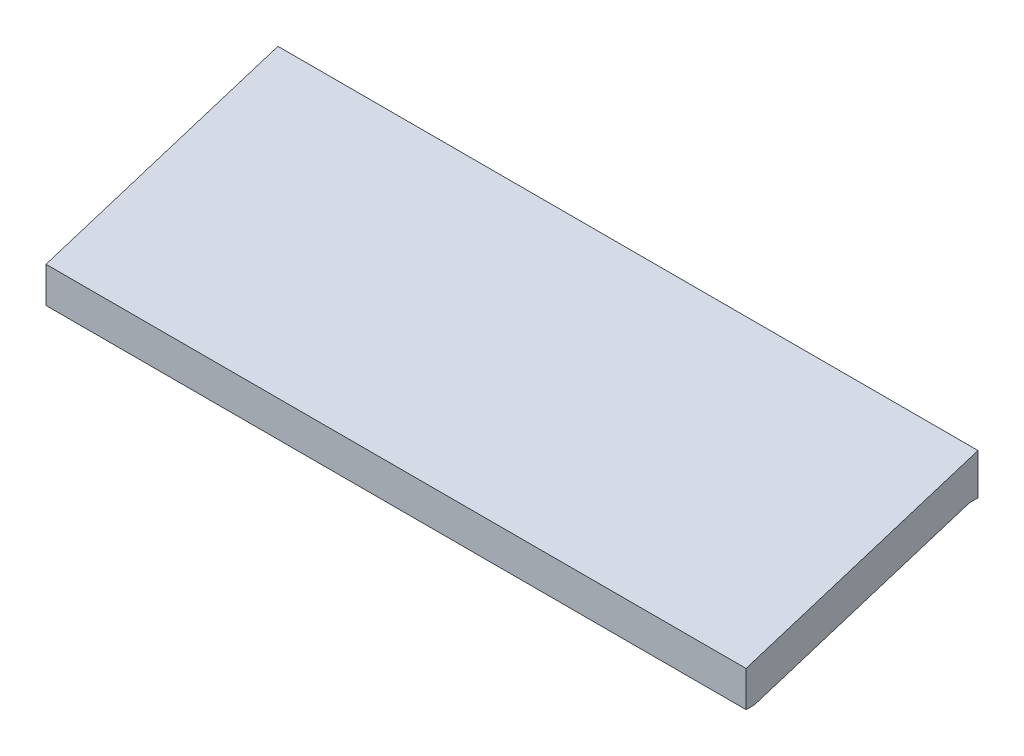
ISO-10303-21;
HEADER;
FILE_DESCRIPTION(('STEP AP214'),'2;1');
FILE_NAME('part.step','',(''),(''),'','','');
FILE_SCHEMA(('AUTOMOTIVE_DESIGN { 1 0 10303 214 1 1 1 1 }'));
ENDSEC;
DATA;
#1=APPLICATION_CONTEXT('core data for automotive mechanical design processes');
#2=APPLICATION_PROTOCOL_DEFINITION('international standard','automotive_design',2000,#1);
#3=PRODUCT_CONTEXT('',#1,'mechanical');
#4=PRODUCT('Part','Part','',(#3));
#5=PRODUCT_RELATED_PRODUCT_CATEGORY('part','',(#4));
#6=PRODUCT_DEFINITION_FORMATION('','',#4);
#7=PRODUCT_DEFINITION_CONTEXT('part definition',#1,'design');
#8=PRODUCT_DEFINITION('design','',#6,#7);
#9=PRODUCT_DEFINITION_SHAPE('','',#8);
#10=(LENGTH_UNIT() NAMED_UNIT(*) SI_UNIT(.MILLI.,.METRE.));
#11=(NAMED_UNIT(*) PLANE_ANGLE_UNIT() SI_UNIT($,.RADIAN.));
#12=(NAMED_UNIT(*) SI_UNIT($,.STERADIAN.) SOLID_ANGLE_UNIT());
#13=UNCERTAINTY_MEASURE_WITH_UNIT(LENGTH_MEASURE(1.E-05),#10,'distance_accuracy_value','');
#14=(GEOMETRIC_REPRESENTATION_CONTEXT(3) GLOBAL_UNCERTAINTY_ASSIGNED_CONTEXT((#13)) GLOBAL_UNIT_ASSIGNED_CONTEXT((#10,
#11,#12)) REPRESENTATION_CONTEXT('',''));
#15=CARTESIAN_POINT('',(0.,0.,0.));
#16=DIRECTION('',(0.,0.,1.));
#17=DIRECTION('',(1.,0.,0.));
#18=AXIS2_PLACEMENT_3D('',#15,#16,#17);
#19=CARTESIAN_POINT('',(166.,0.,-51.));
#20=DIRECTION('',(0.,0.,-1.));
#21=DIRECTION('',(-1.,0.,0.));
#22=AXIS2_PLACEMENT_3D('',#19,#20,#21);
#23=PLANE('',#22);
#24=DIRECTION('',(0.,1.,0.));
#25=VECTOR('',#24,1.);
#26=CARTESIAN_POINT('',(164.,-8.73790810521587,-51.));
#27=LINE('',#26,#25);
#28=CARTESIAN_POINT('',(164.,-8.73790810521587,-51.));
#29=VERTEX_POINT('',#28);
#30=CARTESIAN_POINT('',(164.,-1.73790810521587,-51.));
#31=VERTEX_POINT('',#30);
#32=EDGE_CURVE('E215',#29,#31,#27,.T.);
#33=ORIENTED_EDGE('',*,*,#32,.T.);
#34=DIRECTION('',(-1.,0.,0.));
#35=VECTOR('',#34,1.);
#36=CARTESIAN_POINT('',(166.,-1.73790810521587,-51.));
#37=LINE('',#36,#35);
#38=CARTESIAN_POINT('',(2.,-1.73790810521587,-51.));
#39=VERTEX_POINT('',#38);
#40=EDGE_CURVE('E137',#31,#39,#37,.T.);
#41=ORIENTED_EDGE('',*,*,#40,.T.);
#42=DIRECTION('',(0.,-1.,0.));
#43=VECTOR('',#42,1.);
#44=CARTESIAN_POINT('',(2.,-8.73790810521587,-51.));
#45=LINE('',#44,#43);
#46=CARTESIAN_POINT('',(2.,-8.73790810521587,-51.));
#47=VERTEX_POINT('',#46);
#48=EDGE_CURVE('E131',#39,#47,#45,.T.);
#49=ORIENTED_EDGE('',*,*,#48,.T.);
#50=DIRECTION('',(-1.,0.,0.));
#51=VECTOR('',#50,1.);
#52=CARTESIAN_POINT('',(166.,-8.73790810521587,-51.));
#53=LINE('',#52,#51);
#54=EDGE_CURVE('E40',#29,#47,#53,.T.);
#55=ORIENTED_EDGE('',*,*,#54,.F.);
#56=EDGE_LOOP('',(#33,#41,#49,#55));
#57=FACE_BOUND('',#56,.T.);
#58=ADVANCED_FACE('F33',(#57),#23,.F.);
#59=CARTESIAN_POINT('',(166.,0.,0.));
#60=DIRECTION('',(0.,0.,-1.));
#61=DIRECTION('',(-1.,0.,0.));
#62=AXIS2_PLACEMENT_3D('',#59,#60,#61);
#63=PLANE('',#62);
#64=DIRECTION('',(-1.,0.,0.));
#65=VECTOR('',#64,1.);
#66=CARTESIAN_POINT('',(166.,-17.7379081052159,0.));
#67=LINE('',#66,#65);
#68=CARTESIAN_POINT('',(164.,-17.7379081052159,0.));
#69=VERTEX_POINT('',#68);
#70=CARTESIAN_POINT('',(2.,-17.7379081052159,0.));
#71=VERTEX_POINT('',#70);
#72=EDGE_CURVE('E176',#69,#71,#67,.T.);
#73=ORIENTED_EDGE('',*,*,#72,.F.);
#74=DIRECTION('',(0.,-1.,0.));
#75=VECTOR('',#74,1.);
#76=CARTESIAN_POINT('',(164.,-17.7379081052159,0.));
#77=LINE('',#76,#75);
#78=CARTESIAN_POINT('',(164.,-24.7379081052159,0.));
#79=VERTEX_POINT('',#78);
#80=EDGE_CURVE('E53',#69,#79,#77,.T.);
#81=ORIENTED_EDGE('',*,*,#80,.T.);
#82=DIRECTION('',(-1.,0.,0.));
#83=VECTOR('',#82,1.);
#84=CARTESIAN_POINT('',(166.,-24.7379081052159,0.));
#85=LINE('',#84,#83);
#86=CARTESIAN_POINT('',(2.,-24.7379081052159,0.));
#87=VERTEX_POINT('',#86);
#88=EDGE_CURVE('E178',#79,#87,#85,.T.);
#89=ORIENTED_EDGE('',*,*,#88,.T.);
#90=DIRECTION('',(0.,1.,0.));
#91=VECTOR('',#90,1.);
#92=CARTESIAN_POINT('',(2.,-17.7379081052159,0.));
#93=LINE('',#92,#91);
#94=EDGE_CURVE('E134',#87,#71,#93,.T.);
#95=ORIENTED_EDGE('',*,*,#94,.T.);
#96=EDGE_LOOP('',(#73,#81,#89,#95));
#97=FACE_BOUND('',#96,.T.);
#98=ADVANCED_FACE('F227',(#97),#63,.T.);
#99=CARTESIAN_POINT('',(166.,-16.1485120691867,-5.06619986484289));
#100=DIRECTION('',(0.,-0.954146487587723,-0.299340074537325));
#101=DIRECTION('',(0.,0.299340074537325,-0.954146487587723));
#102=AXIS2_PLACEMENT_3D('',#99,#100,#101);
#103=PLANE('',#102);
#104=ORIENTED_EDGE('',*,*,#40,.F.);
#105=DIRECTION('',(0.,-0.299340074537325,0.954146487587723));
#106=VECTOR('',#105,1.);
#107=CARTESIAN_POINT('',(164.,-1.73790810521587,-51.));
#108=LINE('',#107,#106);
#109=EDGE_CURVE('E211',#31,#69,#108,.T.);
#110=ORIENTED_EDGE('',*,*,#109,.T.);
#111=ORIENTED_EDGE('',*,*,#72,.T.);
#112=DIRECTION('',(0.,0.299340074537325,-0.954146487587723));
#113=VECTOR('',#112,1.);
#114=CARTESIAN_POINT('',(2.,-1.73790810521587,-51.));
#115=LINE('',#114,#113);
#116=EDGE_CURVE('E124',#71,#39,#115,.T.);
#117=ORIENTED_EDGE('',*,*,#116,.T.);
#118=EDGE_LOOP('',(#104,#110,#111,#117));
#119=FACE_BOUND('',#118,.T.);
#120=ADVANCED_FACE('F218',(#119),#103,.T.);
#121=CARTESIAN_POINT('',(166.,-8.73790810521587,0.));
#122=DIRECTION('',(0.,1.,0.));
#123=DIRECTION('',(0.,0.,1.));
#124=AXIS2_PLACEMENT_3D('',#121,#122,#123);
#125=PLANE('',#124);
#126=DIRECTION('',(0.,0.,-1.));
#127=VECTOR('',#126,1.);
#128=CARTESIAN_POINT('',(0.,-8.73790810521587,0.));
#129=LINE('',#128,#127);
#130=CARTESIAN_POINT('',(0.,-8.73790810521587,-51.));
#131=VERTEX_POINT('',#130);
#132=CARTESIAN_POINT('',(0.,-8.73790810521587,-53.));
#133=VERTEX_POINT('',#132);
#134=EDGE_CURVE('E147',#131,#133,#129,.T.);
#135=ORIENTED_EDGE('',*,*,#134,.T.);
#136=DIRECTION('',(-1.,0.,0.));
#137=VECTOR('',#136,1.);
#138=CARTESIAN_POINT('',(166.,-8.73790810521587,-53.));
#139=LINE('',#138,#137);
#140=CARTESIAN_POINT('',(166.,-8.73790810521587,-53.));
#141=VERTEX_POINT('',#140);
#142=EDGE_CURVE('E114',#141,#133,#139,.T.);
#143=ORIENTED_EDGE('',*,*,#142,.F.);
#144=DIRECTION('',(0.,0.,-1.));
#145=VECTOR('',#144,1.);
#146=CARTESIAN_POINT('',(166.,-8.73790810521587,0.));
#147=LINE('',#146,#145);
#148=CARTESIAN_POINT('',(166.,-8.73790810521587,-51.));
#149=VERTEX_POINT('',#148);
#150=EDGE_CURVE('E149',#149,#141,#147,.T.);
#151=ORIENTED_EDGE('',*,*,#150,.F.);
#152=EDGE_CURVE('E11',#149,#29,#53,.T.);
#153=ORIENTED_EDGE('',*,*,#152,.T.);
#154=ORIENTED_EDGE('',*,*,#54,.T.);
#155=DIRECTION('',(-1.,0.,0.));
#156=VECTOR('',#155,1.);
#157=CARTESIAN_POINT('',(2.,-8.73790810521587,-51.));
#158=LINE('',#157,#156);
#159=EDGE_CURVE('E110',#47,#131,#158,.T.);
#160=ORIENTED_EDGE('',*,*,#159,.T.);
#161=EDGE_LOOP('',(#135,#143,#151,#153,#154,#160));
#162=FACE_BOUND('',#161,.T.);
#163=ADVANCED_FACE('F109',(#162),#125,.F.);
#164=CARTESIAN_POINT('',(166.,0.,-53.));
#165=DIRECTION('',(0.,0.,-1.));
#166=DIRECTION('',(-1.,0.,0.));
#167=AXIS2_PLACEMENT_3D('',#164,#165,#166);
#168=PLANE('',#167);
#169=DIRECTION('',(0.,-1.,0.));
#170=VECTOR('',#169,1.);
#171=CARTESIAN_POINT('',(0.,0.,-53.));
#172=LINE('',#171,#170);
#173=CARTESIAN_POINT('',(0.,0.985657073590845,-53.));
#174=VERTEX_POINT('',#173);
#175=EDGE_CURVE('E164',#174,#133,#172,.T.);
#176=ORIENTED_EDGE('',*,*,#175,.F.);
#177=DIRECTION('',(-1.,0.,0.));
#178=VECTOR('',#177,1.);
#179=CARTESIAN_POINT('',(166.,0.985657073590845,-53.));
#180=LINE('',#179,#178);
#181=CARTESIAN_POINT('',(166.,0.985657073590845,-53.));
#182=VERTEX_POINT('',#181);
#183=EDGE_CURVE('E186',#182,#174,#180,.T.);
#184=ORIENTED_EDGE('',*,*,#183,.F.);
#185=DIRECTION('',(0.,-1.,0.));
#186=VECTOR('',#185,1.);
#187=CARTESIAN_POINT('',(166.,0.,-53.));
#188=LINE('',#187,#186);
#189=EDGE_CURVE('E151',#182,#141,#188,.T.);
#190=ORIENTED_EDGE('',*,*,#189,.T.);
#191=ORIENTED_EDGE('',*,*,#142,.T.);
#192=EDGE_LOOP('',(#176,#184,#190,#191));
#193=FACE_BOUND('',#192,.T.);
#194=ADVANCED_FACE('F190',(#193),#168,.T.);
#195=CARTESIAN_POINT('',(166.,-14.2402190940113,-4.46751971576826));
#196=DIRECTION('',(0.,0.954146487587723,0.299340074537325));
#197=DIRECTION('',(0.,-0.299340074537325,0.954146487587723));
#198=AXIS2_PLACEMENT_3D('',#195,#196,#197);
#199=PLANE('',#198);
#200=DIRECTION('',(0.,0.299340074537325,-0.954146487587723));
#201=VECTOR('',#200,1.);
#202=CARTESIAN_POINT('',(0.,-14.2402190940113,-4.46751971576826));
#203=LINE('',#202,#201);
#204=CARTESIAN_POINT('',(0.,-16.2692448871935,2.));
#205=VERTEX_POINT('',#204);
#206=EDGE_CURVE('E167',#205,#174,#203,.T.);
#207=ORIENTED_EDGE('',*,*,#206,.F.);
#208=DIRECTION('',(-1.,0.,0.));
#209=VECTOR('',#208,1.);
#210=CARTESIAN_POINT('',(166.,-16.2692448871935,2.));
#211=LINE('',#210,#209);
#212=CARTESIAN_POINT('',(166.,-16.2692448871935,2.));
#213=VERTEX_POINT('',#212);
#214=EDGE_CURVE('E184',#213,#205,#211,.T.);
#215=ORIENTED_EDGE('',*,*,#214,.F.);
#216=DIRECTION('',(0.,0.299340074537325,-0.954146487587723));
#217=VECTOR('',#216,1.);
#218=CARTESIAN_POINT('',(166.,-14.2402190940113,-4.46751971576826));
#219=LINE('',#218,#217);
#220=EDGE_CURVE('E155',#213,#182,#219,.T.);
#221=ORIENTED_EDGE('',*,*,#220,.T.);
#222=ORIENTED_EDGE('',*,*,#183,.T.);
#223=EDGE_LOOP('',(#207,#215,#221,#222));
#224=FACE_BOUND('',#223,.T.);
#225=ADVANCED_FACE('F198',(#224),#199,.T.);
#226=CARTESIAN_POINT('',(166.,0.,2.));
#227=DIRECTION('',(0.,0.,1.));
#228=DIRECTION('',(1.,0.,0.));
#229=AXIS2_PLACEMENT_3D('',#226,#227,#228);
#230=PLANE('',#229);
#231=DIRECTION('',(0.,1.,0.));
#232=VECTOR('',#231,1.);
#233=CARTESIAN_POINT('',(0.,0.,2.));
#234=LINE('',#233,#232);
#235=CARTESIAN_POINT('',(0.,-24.7379081052159,2.));
#236=VERTEX_POINT('',#235);
#237=EDGE_CURVE('E170',#236,#205,#234,.T.);
#238=ORIENTED_EDGE('',*,*,#237,.F.);
#239=DIRECTION('',(-1.,0.,0.));
#240=VECTOR('',#239,1.);
#241=CARTESIAN_POINT('',(166.,-24.7379081052159,2.));
#242=LINE('',#241,#240);
#243=CARTESIAN_POINT('',(166.,-24.7379081052159,2.));
#244=VERTEX_POINT('',#243);
#245=EDGE_CURVE('E182',#244,#236,#242,.T.);
#246=ORIENTED_EDGE('',*,*,#245,.F.);
#247=DIRECTION('',(0.,1.,0.));
#248=VECTOR('',#247,1.);
#249=CARTESIAN_POINT('',(166.,0.,2.));
#250=LINE('',#249,#248);
#251=EDGE_CURVE('E158',#244,#213,#250,.T.);
#252=ORIENTED_EDGE('',*,*,#251,.T.);
#253=ORIENTED_EDGE('',*,*,#214,.T.);
#254=EDGE_LOOP('',(#238,#246,#252,#253));
#255=FACE_BOUND('',#254,.T.);
#256=ADVANCED_FACE('F241',(#255),#230,.T.);
#257=CARTESIAN_POINT('',(166.,-24.7379081052159,0.));
#258=DIRECTION('',(0.,1.,0.));
#259=DIRECTION('',(0.,0.,1.));
#260=AXIS2_PLACEMENT_3D('',#257,#258,#259);
#261=PLANE('',#260);
#262=DIRECTION('',(0.,0.,-1.));
#263=VECTOR('',#262,1.);
#264=CARTESIAN_POINT('',(0.,-24.7379081052159,0.));
#265=LINE('',#264,#263);
#266=CARTESIAN_POINT('',(0.,-24.7379081052159,0.));
#267=VERTEX_POINT('',#266);
#268=EDGE_CURVE('E152',#236,#267,#265,.T.);
#269=ORIENTED_EDGE('',*,*,#268,.T.);
#270=DIRECTION('',(-1.,0.,0.));
#271=VECTOR('',#270,1.);
#272=CARTESIAN_POINT('',(2.,-24.7379081052159,0.));
#273=LINE('',#272,#271);
#274=EDGE_CURVE('E123',#87,#267,#273,.T.);
#275=ORIENTED_EDGE('',*,*,#274,.F.);
#276=ORIENTED_EDGE('',*,*,#88,.F.);
#277=CARTESIAN_POINT('',(166.,-24.7379081052159,0.));
#278=VERTEX_POINT('',#277);
#279=EDGE_CURVE('E179',#278,#79,#85,.T.);
#280=ORIENTED_EDGE('',*,*,#279,.F.);
#281=DIRECTION('',(0.,0.,-1.));
#282=VECTOR('',#281,1.);
#283=CARTESIAN_POINT('',(166.,-24.7379081052159,0.));
#284=LINE('',#283,#282);
#285=EDGE_CURVE('E161',#244,#278,#284,.T.);
#286=ORIENTED_EDGE('',*,*,#285,.F.);
#287=ORIENTED_EDGE('',*,*,#245,.T.);
#288=EDGE_LOOP('',(#269,#275,#276,#280,#286,#287));
#289=FACE_BOUND('',#288,.T.);
#290=ADVANCED_FACE('F238',(#289),#261,.F.);
#291=CARTESIAN_POINT('',(166.,0.,0.));
#292=DIRECTION('',(1.,0.,0.));
#293=DIRECTION('',(0.,0.,-1.));
#294=AXIS2_PLACEMENT_3D('',#291,#292,#293);
#295=PLANE('',#294);
#296=DIRECTION('',(0.,0.299340074537325,-0.954146487587723));
#297=VECTOR('',#296,1.);
#298=CARTESIAN_POINT('',(166.,-24.7379081052159,0.));
#299=LINE('',#298,#297);
#300=EDGE_CURVE('E142',#278,#149,#299,.T.);
#301=ORIENTED_EDGE('',*,*,#300,.T.);
#302=ORIENTED_EDGE('',*,*,#150,.T.);
#303=ORIENTED_EDGE('',*,*,#189,.F.);
#304=ORIENTED_EDGE('',*,*,#220,.F.);
#305=ORIENTED_EDGE('',*,*,#251,.F.);
#306=ORIENTED_EDGE('',*,*,#285,.T.);
#307=EDGE_LOOP('',(#301,#302,#303,#304,#305,#306));
#308=FACE_BOUND('',#307,.T.);
#309=ADVANCED_FACE('F202',(#308),#295,.T.);
#310=CARTESIAN_POINT('',(0.,0.,0.));
#311=DIRECTION('',(1.,0.,0.));
#312=DIRECTION('',(0.,0.,-1.));
#313=AXIS2_PLACEMENT_3D('',#310,#311,#312);
#314=PLANE('',#313);
#315=ORIENTED_EDGE('',*,*,#134,.F.);
#316=DIRECTION('',(0.,-0.299340074537325,0.954146487587723));
#317=VECTOR('',#316,1.);
#318=CARTESIAN_POINT('',(0.,-24.7379081052159,0.));
#319=LINE('',#318,#317);
#320=EDGE_CURVE('E122',#131,#267,#319,.T.);
#321=ORIENTED_EDGE('',*,*,#320,.T.);
#322=ORIENTED_EDGE('',*,*,#268,.F.);
#323=ORIENTED_EDGE('',*,*,#237,.T.);
#324=ORIENTED_EDGE('',*,*,#206,.T.);
#325=ORIENTED_EDGE('',*,*,#175,.T.);
#326=EDGE_LOOP('',(#315,#321,#322,#323,#324,#325));
#327=FACE_BOUND('',#326,.T.);
#328=ADVANCED_FACE('F193',(#327),#314,.F.);
#329=CARTESIAN_POINT('',(2.,-24.7379081052159,0.));
#330=DIRECTION('',(0.,-0.954146487587723,-0.299340074537325));
#331=DIRECTION('',(0.,0.299340074537325,-0.954146487587723));
#332=AXIS2_PLACEMENT_3D('',#329,#330,#331);
#333=PLANE('',#332);
#334=ORIENTED_EDGE('',*,*,#320,.F.);
#335=ORIENTED_EDGE('',*,*,#159,.F.);
#336=DIRECTION('',(0.,-0.299340074537325,0.954146487587723));
#337=VECTOR('',#336,1.);
#338=CARTESIAN_POINT('',(2.,-24.7379081052159,0.));
#339=LINE('',#338,#337);
#340=EDGE_CURVE('E120',#47,#87,#339,.T.);
#341=ORIENTED_EDGE('',*,*,#340,.T.);
#342=ORIENTED_EDGE('',*,*,#274,.T.);
#343=EDGE_LOOP('',(#334,#335,#341,#342));
#344=FACE_BOUND('',#343,.T.);
#345=ADVANCED_FACE('F118',(#344),#333,.T.);
#346=CARTESIAN_POINT('',(2.,0.,0.));
#347=DIRECTION('',(1.,0.,0.));
#348=DIRECTION('',(0.,0.,-1.));
#349=AXIS2_PLACEMENT_3D('',#346,#347,#348);
#350=PLANE('',#349);
#351=ORIENTED_EDGE('',*,*,#48,.F.);
#352=ORIENTED_EDGE('',*,*,#116,.F.);
#353=ORIENTED_EDGE('',*,*,#94,.F.);
#354=ORIENTED_EDGE('',*,*,#340,.F.);
#355=EDGE_LOOP('',(#351,#352,#353,#354));
#356=FACE_BOUND('',#355,.T.);
#357=ADVANCED_FACE('F129',(#356),#350,.T.);
#358=CARTESIAN_POINT('',(164.,-24.7379081052159,0.));
#359=DIRECTION('',(0.,-0.954146487587723,-0.299340074537325));
#360=DIRECTION('',(0.,0.299340074537325,-0.954146487587723));
#361=AXIS2_PLACEMENT_3D('',#358,#359,#360);
#362=PLANE('',#361);
#363=ORIENTED_EDGE('',*,*,#300,.F.);
#364=ORIENTED_EDGE('',*,*,#279,.T.);
#365=DIRECTION('',(0.,0.299340074537325,-0.954146487587723));
#366=VECTOR('',#365,1.);
#367=CARTESIAN_POINT('',(164.,-24.7379081052159,0.));
#368=LINE('',#367,#366);
#369=EDGE_CURVE('E139',#79,#29,#368,.T.);
#370=ORIENTED_EDGE('',*,*,#369,.T.);
#371=ORIENTED_EDGE('',*,*,#152,.F.);
#372=EDGE_LOOP('',(#363,#364,#370,#371));
#373=FACE_BOUND('',#372,.T.);
#374=ADVANCED_FACE('F207',(#373),#362,.T.);
#375=CARTESIAN_POINT('',(164.,0.,0.));
#376=DIRECTION('',(1.,0.,0.));
#377=DIRECTION('',(0.,0.,-1.));
#378=AXIS2_PLACEMENT_3D('',#375,#376,#377);
#379=PLANE('',#378);
#380=ORIENTED_EDGE('',*,*,#32,.F.);
#381=ORIENTED_EDGE('',*,*,#369,.F.);
#382=ORIENTED_EDGE('',*,*,#80,.F.);
#383=ORIENTED_EDGE('',*,*,#109,.F.);
#384=EDGE_LOOP('',(#380,#381,#382,#383));
#385=FACE_BOUND('',#384,.T.);
#386=ADVANCED_FACE('F219',(#385),#379,.F.);
#387=CLOSED_SHELL('',(#58,#98,#120,#163,#194,#225,#256,#290,#309,#328,#345,#357,#374,#386));
#388=MANIFOLD_SOLID_BREP('B2',#387);
#389=ADVANCED_BREP_SHAPE_REPRESENTATION('',(#18,#388),#14);
#390=SHAPE_DEFINITION_REPRESENTATION(#9,#389);
ENDSEC;
END-ISO-10303-21;
